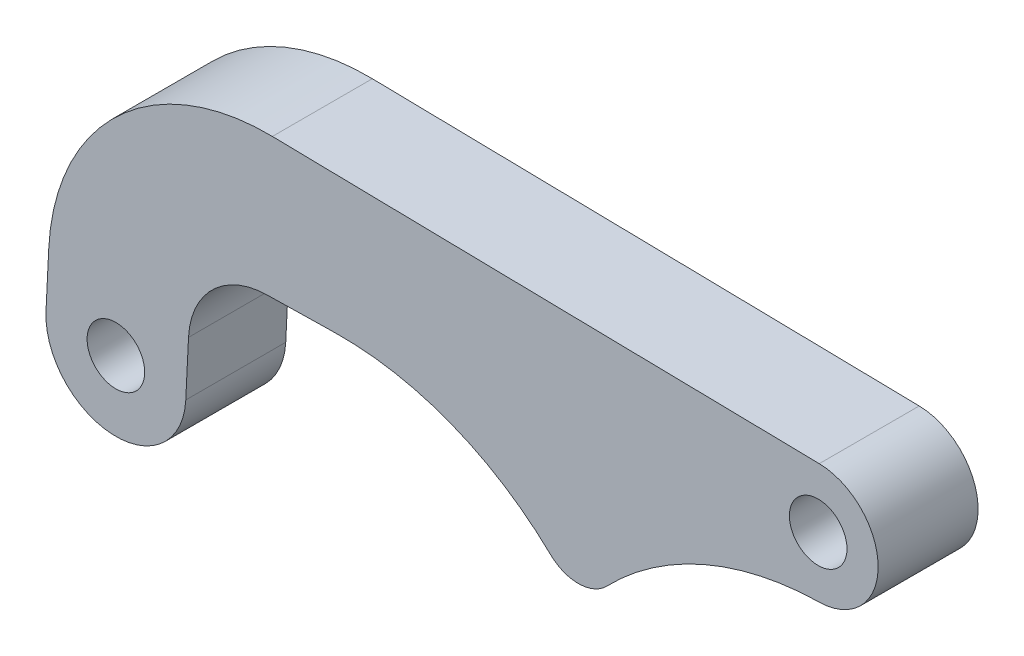
ISO-10303-21;
HEADER;
FILE_DESCRIPTION(('STEP AP214'),'2;1');
FILE_NAME('part.step','',(''),(''),'','','');
FILE_SCHEMA(('AUTOMOTIVE_DESIGN { 1 0 10303 214 1 1 1 1 }'));
ENDSEC;
DATA;
#1=APPLICATION_CONTEXT('core data for automotive mechanical design processes');
#2=APPLICATION_PROTOCOL_DEFINITION('international standard','automotive_design',2000,#1);
#3=PRODUCT_CONTEXT('',#1,'mechanical');
#4=PRODUCT('Part','Part','',(#3));
#5=PRODUCT_RELATED_PRODUCT_CATEGORY('part','',(#4));
#6=PRODUCT_DEFINITION_FORMATION('','',#4);
#7=PRODUCT_DEFINITION_CONTEXT('part definition',#1,'design');
#8=PRODUCT_DEFINITION('design','',#6,#7);
#9=PRODUCT_DEFINITION_SHAPE('','',#8);
#10=(LENGTH_UNIT() NAMED_UNIT(*) SI_UNIT(.MILLI.,.METRE.));
#11=(NAMED_UNIT(*) PLANE_ANGLE_UNIT() SI_UNIT($,.RADIAN.));
#12=(NAMED_UNIT(*) SI_UNIT($,.STERADIAN.) SOLID_ANGLE_UNIT());
#13=UNCERTAINTY_MEASURE_WITH_UNIT(LENGTH_MEASURE(1.E-05),#10,'distance_accuracy_value','');
#14=(GEOMETRIC_REPRESENTATION_CONTEXT(3) GLOBAL_UNCERTAINTY_ASSIGNED_CONTEXT((#13)) GLOBAL_UNIT_ASSIGNED_CONTEXT((#10,
#11,#12)) REPRESENTATION_CONTEXT('',''));
#15=CARTESIAN_POINT('',(0.,0.,0.));
#16=DIRECTION('',(0.,0.,1.));
#17=DIRECTION('',(1.,0.,0.));
#18=AXIS2_PLACEMENT_3D('',#15,#16,#17);
#19=CARTESIAN_POINT('',(56.2899549373158,-13.0988698531482,3.96875));
#20=DIRECTION('',(0.,0.,-1.));
#21=DIRECTION('',(-1.,0.,0.));
#22=AXIS2_PLACEMENT_3D('',#19,#20,#21);
#23=PLANE('',#22);
#24=CARTESIAN_POINT('',(56.2899549373158,-13.0988698531482,3.96875));
#25=DIRECTION('',(0.,0.,-1.));
#26=DIRECTION('',(-1.,0.,0.));
#27=AXIS2_PLACEMENT_3D('',#24,#25,#26);
#28=CIRCLE('',#27,24.0789684534632);
#29=CARTESIAN_POINT('',(38.995923428398,3.65562792957969,3.96875));
#30=VERTEX_POINT('',#29);
#31=CARTESIAN_POINT('',(55.8521603028593,10.9761183636904,3.96875));
#32=VERTEX_POINT('',#31);
#33=EDGE_CURVE('E206',#30,#32,#28,.T.);
#34=ORIENTED_EDGE('',*,*,#33,.T.);
#35=CARTESIAN_POINT('',(55.7655703415565,15.7378311257752,3.96875));
#36=DIRECTION('',(0.,0.,1.));
#37=DIRECTION('',(1.,0.,0.));
#38=AXIS2_PLACEMENT_3D('',#35,#36,#37);
#39=CIRCLE('',#38,4.7625);
#40=CARTESIAN_POINT('',(55.8521603028593,20.4995438878601,3.96875));
#41=VERTEX_POINT('',#40);
#42=EDGE_CURVE('E121',#32,#41,#39,.T.);
#43=ORIENTED_EDGE('',*,*,#42,.T.);
#44=DIRECTION('',(-0.999834700700227,0.018181619171209,0.));
#45=VECTOR('',#44,1.);
#46=CARTESIAN_POINT('',(55.8521603028593,20.4995438878601,3.96875));
#47=LINE('',#46,#45);
#48=CARTESIAN_POINT('',(12.4263390179737,21.2892261665865,3.96875));
#49=VERTEX_POINT('',#48);
#50=EDGE_CURVE('E235',#41,#49,#47,.T.);
#51=ORIENTED_EDGE('',*,*,#50,.T.);
#52=CARTESIAN_POINT('',(12.1088424931964,3.82961270560882,3.96875));
#53=DIRECTION('',(0.,0.,1.));
#54=DIRECTION('',(1.,0.,0.));
#55=AXIS2_PLACEMENT_3D('',#52,#53,#54);
#56=CIRCLE('',#55,17.4625);
#57=CARTESIAN_POINT('',(-5.33260441290076,4.68683850537986,3.96875));
#58=VERTEX_POINT('',#57);
#59=EDGE_CURVE('E255',#49,#58,#56,.T.);
#60=ORIENTED_EDGE('',*,*,#59,.T.);
#61=DIRECTION('',(-0.0490895232510259,-0.998794382596832,0.));
#62=VECTOR('',#61,1.);
#63=CARTESIAN_POINT('',(-5.54955128830365,0.272753663563513,3.96875));
#64=LINE('',#63,#62);
#65=CARTESIAN_POINT('',(-5.54955128830365,0.272753663563513,3.96875));
#66=VERTEX_POINT('',#65);
#67=EDGE_CURVE('E251',#58,#66,#64,.T.);
#68=ORIENTED_EDGE('',*,*,#67,.T.);
#69=CARTESIAN_POINT('',(0.,0.,3.96875));
#70=DIRECTION('',(0.,0.,1.));
#71=DIRECTION('',(1.,0.,0.));
#72=AXIS2_PLACEMENT_3D('',#69,#70,#71);
#73=CIRCLE('',#72,5.55625);
#74=CARTESIAN_POINT('',(5.54955128830365,-0.272753663563516,3.96875));
#75=VERTEX_POINT('',#74);
#76=EDGE_CURVE('E254',#66,#75,#73,.T.);
#77=ORIENTED_EDGE('',*,*,#76,.T.);
#78=DIRECTION('',(0.0490895232510259,0.998794382596832,0.));
#79=VECTOR('',#78,1.);
#80=CARTESIAN_POINT('',(5.54955128830365,-0.272753663563514,3.96875));
#81=LINE('',#80,#79);
#82=CARTESIAN_POINT('',(5.76649816370654,4.14133117825284,3.96875));
#83=VERTEX_POINT('',#82);
#84=EDGE_CURVE('E258',#75,#83,#81,.T.);
#85=ORIENTED_EDGE('',*,*,#84,.T.);
#86=CARTESIAN_POINT('',(12.1088424931964,3.82961270560882,3.96875));
#87=DIRECTION('',(0.,0.,-1.));
#88=DIRECTION('',(1.,0.,0.));
#89=AXIS2_PLACEMENT_3D('',#86,#87,#88);
#90=CIRCLE('',#89,6.35000000000001);
#91=CARTESIAN_POINT('',(11.9933892114592,10.1785630550553,3.96875));
#92=VERTEX_POINT('',#91);
#93=EDGE_CURVE('E155',#83,#92,#90,.T.);
#94=ORIENTED_EDGE('',*,*,#93,.T.);
#95=DIRECTION('',(0.999834700700227,0.0181816191712081,0.));
#96=VECTOR('',#95,1.);
#97=CARTESIAN_POINT('',(17.4058004576478,10.2769857243298,3.96875));
#98=LINE('',#97,#96);
#99=CARTESIAN_POINT('',(17.4058004576478,10.2769857243298,3.96875));
#100=VERTEX_POINT('',#99);
#101=EDGE_CURVE('E149',#92,#100,#98,.T.);
#102=ORIENTED_EDGE('',*,*,#101,.T.);
#103=CARTESIAN_POINT('',(17.8435950921042,-13.7980024925089,3.96875));
#104=DIRECTION('',(0.,0.,-1.));
#105=DIRECTION('',(-1.,0.,0.));
#106=AXIS2_PLACEMENT_3D('',#103,#104,#105);
#107=CIRCLE('',#106,24.0789684534632);
#108=CARTESIAN_POINT('',(34.5170456929599,3.57418121719502,3.96875));
#109=VERTEX_POINT('',#108);
#110=EDGE_CURVE('E153',#100,#109,#107,.T.);
#111=ORIENTED_EDGE('',*,*,#110,.T.);
#112=CARTESIAN_POINT('',(36.7155703415565,5.86483928192524,3.96875));
#113=DIRECTION('',(0.,0.,1.));
#114=DIRECTION('',(1.,0.,0.));
#115=AXIS2_PLACEMENT_3D('',#112,#113,#114);
#116=CIRCLE('',#115,3.175);
#117=EDGE_CURVE('E62',#109,#30,#116,.T.);
#118=ORIENTED_EDGE('',*,*,#117,.T.);
#119=EDGE_LOOP('',(#34,#43,#51,#60,#68,#77,#85,#94,#102,#111,#118));
#120=FACE_BOUND('',#119,.T.);
#121=CARTESIAN_POINT('',(0.,0.,3.96875));
#122=DIRECTION('',(0.,0.,1.));
#123=DIRECTION('',(1.,0.,0.));
#124=AXIS2_PLACEMENT_3D('',#121,#122,#123);
#125=CIRCLE('',#124,2.286);
#126=CARTESIAN_POINT('',(2.286,0.,3.96875));
#127=VERTEX_POINT('',#126);
#128=EDGE_CURVE('E181',#127,#127,#125,.T.);
#129=ORIENTED_EDGE('',*,*,#128,.F.);
#130=EDGE_LOOP('',(#129));
#131=FACE_BOUND('',#130,.T.);
#132=CARTESIAN_POINT('',(55.7655703415565,15.7378311257752,3.96875));
#133=DIRECTION('',(0.,0.,1.));
#134=DIRECTION('',(1.,0.,0.));
#135=AXIS2_PLACEMENT_3D('',#132,#133,#134);
#136=CIRCLE('',#135,2.286);
#137=CARTESIAN_POINT('',(58.0515703415565,15.7378311257752,3.96875));
#138=VERTEX_POINT('',#137);
#139=EDGE_CURVE('E272',#138,#138,#136,.T.);
#140=ORIENTED_EDGE('',*,*,#139,.F.);
#141=EDGE_LOOP('',(#140));
#142=FACE_BOUND('',#141,.T.);
#143=ADVANCED_FACE('F45',(#120,#131,#142),#23,.F.);
#144=CARTESIAN_POINT('',(56.2899549373158,-13.0988698531482,-3.96875));
#145=DIRECTION('',(0.,0.,-1.));
#146=DIRECTION('',(-1.,0.,0.));
#147=AXIS2_PLACEMENT_3D('',#144,#145,#146);
#148=PLANE('',#147);
#149=CARTESIAN_POINT('',(0.,0.,-3.96875));
#150=DIRECTION('',(0.,0.,1.));
#151=DIRECTION('',(1.,0.,0.));
#152=AXIS2_PLACEMENT_3D('',#149,#150,#151);
#153=CIRCLE('',#152,2.286);
#154=CARTESIAN_POINT('',(2.286,0.,-3.96875));
#155=VERTEX_POINT('',#154);
#156=EDGE_CURVE('E268',#155,#155,#153,.T.);
#157=ORIENTED_EDGE('',*,*,#156,.T.);
#158=EDGE_LOOP('',(#157));
#159=FACE_BOUND('',#158,.T.);
#160=CARTESIAN_POINT('',(56.2899549373158,-13.0988698531482,-3.96875));
#161=DIRECTION('',(0.,0.,-1.));
#162=DIRECTION('',(-1.,0.,0.));
#163=AXIS2_PLACEMENT_3D('',#160,#161,#162);
#164=CIRCLE('',#163,24.0789684534632);
#165=CARTESIAN_POINT('',(38.995923428398,3.65562792957969,-3.96875));
#166=VERTEX_POINT('',#165);
#167=CARTESIAN_POINT('',(55.8521603028593,10.9761183636904,-3.96875));
#168=VERTEX_POINT('',#167);
#169=EDGE_CURVE('E177',#166,#168,#164,.T.);
#170=ORIENTED_EDGE('',*,*,#169,.F.);
#171=CARTESIAN_POINT('',(36.7155703415565,5.86483928192524,-3.96875));
#172=DIRECTION('',(0.,0.,1.));
#173=DIRECTION('',(1.,0.,0.));
#174=AXIS2_PLACEMENT_3D('',#171,#172,#173);
#175=CIRCLE('',#174,3.175);
#176=CARTESIAN_POINT('',(34.5170456929599,3.57418121719502,-3.96875));
#177=VERTEX_POINT('',#176);
#178=EDGE_CURVE('E113',#177,#166,#175,.T.);
#179=ORIENTED_EDGE('',*,*,#178,.F.);
#180=CARTESIAN_POINT('',(17.8435950921042,-13.7980024925089,-3.96875));
#181=DIRECTION('',(0.,0.,-1.));
#182=DIRECTION('',(-1.,0.,0.));
#183=AXIS2_PLACEMENT_3D('',#180,#181,#182);
#184=CIRCLE('',#183,24.0789684534632);
#185=CARTESIAN_POINT('',(17.4058004576478,10.2769857243298,-3.96875));
#186=VERTEX_POINT('',#185);
#187=EDGE_CURVE('E107',#186,#177,#184,.T.);
#188=ORIENTED_EDGE('',*,*,#187,.F.);
#189=DIRECTION('',(0.999834700700227,0.0181816191712081,0.));
#190=VECTOR('',#189,1.);
#191=CARTESIAN_POINT('',(17.4058004576478,10.2769857243298,-3.96875));
#192=LINE('',#191,#190);
#193=CARTESIAN_POINT('',(11.9933892114592,10.1785630550553,-3.96875));
#194=VERTEX_POINT('',#193);
#195=EDGE_CURVE('E164',#194,#186,#192,.T.);
#196=ORIENTED_EDGE('',*,*,#195,.F.);
#197=CARTESIAN_POINT('',(12.1088424931964,3.82961270560882,-3.96875));
#198=DIRECTION('',(0.,0.,-1.));
#199=DIRECTION('',(1.,0.,0.));
#200=AXIS2_PLACEMENT_3D('',#197,#198,#199);
#201=CIRCLE('',#200,6.35000000000001);
#202=CARTESIAN_POINT('',(5.76649816370654,4.14133117825284,-3.96875));
#203=VERTEX_POINT('',#202);
#204=EDGE_CURVE('E198',#203,#194,#201,.T.);
#205=ORIENTED_EDGE('',*,*,#204,.F.);
#206=DIRECTION('',(0.0490895232510259,0.998794382596832,0.));
#207=VECTOR('',#206,1.);
#208=CARTESIAN_POINT('',(5.54955128830365,-0.272753663563514,-3.96875));
#209=LINE('',#208,#207);
#210=CARTESIAN_POINT('',(5.54955128830365,-0.272753663563516,-3.96875));
#211=VERTEX_POINT('',#210);
#212=EDGE_CURVE('E195',#211,#203,#209,.T.);
#213=ORIENTED_EDGE('',*,*,#212,.F.);
#214=CARTESIAN_POINT('',(0.,0.,-3.96875));
#215=DIRECTION('',(0.,0.,1.));
#216=DIRECTION('',(1.,0.,0.));
#217=AXIS2_PLACEMENT_3D('',#214,#215,#216);
#218=CIRCLE('',#217,5.55625);
#219=CARTESIAN_POINT('',(-5.54955128830365,0.272753663563513,-3.96875));
#220=VERTEX_POINT('',#219);
#221=EDGE_CURVE('E192',#220,#211,#218,.T.);
#222=ORIENTED_EDGE('',*,*,#221,.F.);
#223=DIRECTION('',(-0.0490895232510259,-0.998794382596832,0.));
#224=VECTOR('',#223,1.);
#225=CARTESIAN_POINT('',(-5.54955128830365,0.272753663563513,-3.96875));
#226=LINE('',#225,#224);
#227=CARTESIAN_POINT('',(-5.33260441290076,4.68683850537986,-3.96875));
#228=VERTEX_POINT('',#227);
#229=EDGE_CURVE('E189',#228,#220,#226,.T.);
#230=ORIENTED_EDGE('',*,*,#229,.F.);
#231=CARTESIAN_POINT('',(12.1088424931964,3.82961270560882,-3.96875));
#232=DIRECTION('',(0.,0.,1.));
#233=DIRECTION('',(1.,0.,0.));
#234=AXIS2_PLACEMENT_3D('',#231,#232,#233);
#235=CIRCLE('',#234,17.4625);
#236=CARTESIAN_POINT('',(12.4263390179737,21.2892261665865,-3.96875));
#237=VERTEX_POINT('',#236);
#238=EDGE_CURVE('E186',#237,#228,#235,.T.);
#239=ORIENTED_EDGE('',*,*,#238,.F.);
#240=DIRECTION('',(-0.999834700700227,0.018181619171209,0.));
#241=VECTOR('',#240,1.);
#242=CARTESIAN_POINT('',(55.8521603028593,20.4995438878601,-3.96875));
#243=LINE('',#242,#241);
#244=CARTESIAN_POINT('',(55.8521603028593,20.4995438878601,-3.96875));
#245=VERTEX_POINT('',#244);
#246=EDGE_CURVE('E183',#245,#237,#243,.T.);
#247=ORIENTED_EDGE('',*,*,#246,.F.);
#248=CARTESIAN_POINT('',(55.7655703415565,15.7378311257752,-3.96875));
#249=DIRECTION('',(0.,0.,1.));
#250=DIRECTION('',(1.,0.,0.));
#251=AXIS2_PLACEMENT_3D('',#248,#249,#250);
#252=CIRCLE('',#251,4.7625);
#253=EDGE_CURVE('E180',#168,#245,#252,.T.);
#254=ORIENTED_EDGE('',*,*,#253,.F.);
#255=EDGE_LOOP('',(#170,#179,#188,#196,#205,#213,#222,#230,#239,#247,#254));
#256=FACE_BOUND('',#255,.T.);
#257=CARTESIAN_POINT('',(55.7655703415565,15.7378311257752,-3.96875));
#258=DIRECTION('',(0.,0.,1.));
#259=DIRECTION('',(1.,0.,0.));
#260=AXIS2_PLACEMENT_3D('',#257,#258,#259);
#261=CIRCLE('',#260,2.286);
#262=CARTESIAN_POINT('',(58.0515703415565,15.7378311257752,-3.96875));
#263=VERTEX_POINT('',#262);
#264=EDGE_CURVE('E277',#263,#263,#261,.T.);
#265=ORIENTED_EDGE('',*,*,#264,.T.);
#266=EDGE_LOOP('',(#265));
#267=FACE_BOUND('',#266,.T.);
#268=ADVANCED_FACE('F239',(#159,#256,#267),#148,.T.);
#269=CARTESIAN_POINT('',(56.2899549373158,-13.0988698531482,3.96875));
#270=DIRECTION('',(0.,0.,-1.));
#271=DIRECTION('',(-1.,0.,0.));
#272=AXIS2_PLACEMENT_3D('',#269,#270,#271);
#273=CYLINDRICAL_SURFACE('',#272,24.0789684534632);
#274=ORIENTED_EDGE('',*,*,#169,.T.);
#275=DIRECTION('',(0.,0.,-1.));
#276=VECTOR('',#275,1.);
#277=CARTESIAN_POINT('',(55.8521603028593,10.9761183636904,3.96875));
#278=LINE('',#277,#276);
#279=EDGE_CURVE('E11',#32,#168,#278,.T.);
#280=ORIENTED_EDGE('',*,*,#279,.F.);
#281=ORIENTED_EDGE('',*,*,#33,.F.);
#282=DIRECTION('',(0.,0.,-1.));
#283=VECTOR('',#282,1.);
#284=CARTESIAN_POINT('',(38.995923428398,3.65562792957969,3.96875));
#285=LINE('',#284,#283);
#286=EDGE_CURVE('E173',#30,#166,#285,.T.);
#287=ORIENTED_EDGE('',*,*,#286,.T.);
#288=EDGE_LOOP('',(#274,#280,#281,#287));
#289=FACE_BOUND('',#288,.T.);
#290=ADVANCED_FACE('F47',(#289),#273,.F.);
#291=CARTESIAN_POINT('',(55.7655703415565,15.7378311257752,3.96875));
#292=DIRECTION('',(0.,0.,-1.));
#293=DIRECTION('',(-1.,0.,0.));
#294=AXIS2_PLACEMENT_3D('',#291,#292,#293);
#295=CYLINDRICAL_SURFACE('',#294,4.7625);
#296=ORIENTED_EDGE('',*,*,#253,.T.);
#297=DIRECTION('',(0.,0.,-1.));
#298=VECTOR('',#297,1.);
#299=CARTESIAN_POINT('',(55.8521603028593,20.4995438878601,3.96875));
#300=LINE('',#299,#298);
#301=EDGE_CURVE('E54',#41,#245,#300,.T.);
#302=ORIENTED_EDGE('',*,*,#301,.F.);
#303=ORIENTED_EDGE('',*,*,#42,.F.);
#304=ORIENTED_EDGE('',*,*,#279,.T.);
#305=EDGE_LOOP('',(#296,#302,#303,#304));
#306=FACE_BOUND('',#305,.T.);
#307=ADVANCED_FACE('F286',(#306),#295,.T.);
#308=CARTESIAN_POINT('',(55.8521603028593,20.4995438878601,3.96875));
#309=DIRECTION('',(-0.018181619171209,-0.999834700700227,0.));
#310=DIRECTION('',(0.999834700700227,-0.018181619171209,0.));
#311=AXIS2_PLACEMENT_3D('',#308,#309,#310);
#312=PLANE('',#311);
#313=ORIENTED_EDGE('',*,*,#246,.T.);
#314=DIRECTION('',(0.,0.,-1.));
#315=VECTOR('',#314,1.);
#316=CARTESIAN_POINT('',(12.4263390179737,21.2892261665865,3.96875));
#317=LINE('',#316,#315);
#318=EDGE_CURVE('E227',#49,#237,#317,.T.);
#319=ORIENTED_EDGE('',*,*,#318,.F.);
#320=ORIENTED_EDGE('',*,*,#50,.F.);
#321=ORIENTED_EDGE('',*,*,#301,.T.);
#322=EDGE_LOOP('',(#313,#319,#320,#321));
#323=FACE_BOUND('',#322,.T.);
#324=ADVANCED_FACE('F233',(#323),#312,.F.);
#325=CARTESIAN_POINT('',(12.1088424931964,3.82961270560882,3.96875));
#326=DIRECTION('',(0.,0.,-1.));
#327=DIRECTION('',(-1.,0.,0.));
#328=AXIS2_PLACEMENT_3D('',#325,#326,#327);
#329=CYLINDRICAL_SURFACE('',#328,17.4625);
#330=ORIENTED_EDGE('',*,*,#238,.T.);
#331=DIRECTION('',(0.,0.,-1.));
#332=VECTOR('',#331,1.);
#333=CARTESIAN_POINT('',(-5.33260441290076,4.68683850537986,3.96875));
#334=LINE('',#333,#332);
#335=EDGE_CURVE('E223',#58,#228,#334,.T.);
#336=ORIENTED_EDGE('',*,*,#335,.F.);
#337=ORIENTED_EDGE('',*,*,#59,.F.);
#338=ORIENTED_EDGE('',*,*,#318,.T.);
#339=EDGE_LOOP('',(#330,#336,#337,#338));
#340=FACE_BOUND('',#339,.T.);
#341=ADVANCED_FACE('F245',(#340),#329,.T.);
#342=CARTESIAN_POINT('',(-5.54955128830365,0.272753663563513,3.96875));
#343=DIRECTION('',(0.998794382596832,-0.0490895232510259,0.));
#344=DIRECTION('',(0.0490895232510259,0.998794382596832,0.));
#345=AXIS2_PLACEMENT_3D('',#342,#343,#344);
#346=PLANE('',#345);
#347=ORIENTED_EDGE('',*,*,#229,.T.);
#348=DIRECTION('',(0.,0.,-1.));
#349=VECTOR('',#348,1.);
#350=CARTESIAN_POINT('',(-5.54955128830365,0.272753663563513,3.96875));
#351=LINE('',#350,#349);
#352=EDGE_CURVE('E219',#66,#220,#351,.T.);
#353=ORIENTED_EDGE('',*,*,#352,.F.);
#354=ORIENTED_EDGE('',*,*,#67,.F.);
#355=ORIENTED_EDGE('',*,*,#335,.T.);
#356=EDGE_LOOP('',(#347,#353,#354,#355));
#357=FACE_BOUND('',#356,.T.);
#358=ADVANCED_FACE('F249',(#357),#346,.F.);
#359=CARTESIAN_POINT('',(0.,0.,3.96875));
#360=DIRECTION('',(0.,0.,-1.));
#361=DIRECTION('',(-1.,0.,0.));
#362=AXIS2_PLACEMENT_3D('',#359,#360,#361);
#363=CYLINDRICAL_SURFACE('',#362,5.55625);
#364=ORIENTED_EDGE('',*,*,#221,.T.);
#365=DIRECTION('',(0.,0.,-1.));
#366=VECTOR('',#365,1.);
#367=CARTESIAN_POINT('',(5.54955128830365,-0.272753663563516,3.96875));
#368=LINE('',#367,#366);
#369=EDGE_CURVE('E215',#75,#211,#368,.T.);
#370=ORIENTED_EDGE('',*,*,#369,.F.);
#371=ORIENTED_EDGE('',*,*,#76,.F.);
#372=ORIENTED_EDGE('',*,*,#352,.T.);
#373=EDGE_LOOP('',(#364,#370,#371,#372));
#374=FACE_BOUND('',#373,.T.);
#375=ADVANCED_FACE('F316',(#374),#363,.T.);
#376=CARTESIAN_POINT('',(5.54955128830365,-0.272753663563514,3.96875));
#377=DIRECTION('',(-0.998794382596832,0.0490895232510259,0.));
#378=DIRECTION('',(-0.0490895232510259,-0.998794382596832,0.));
#379=AXIS2_PLACEMENT_3D('',#376,#377,#378);
#380=PLANE('',#379);
#381=ORIENTED_EDGE('',*,*,#212,.T.);
#382=DIRECTION('',(0.,0.,-1.));
#383=VECTOR('',#382,1.);
#384=CARTESIAN_POINT('',(5.76649816370654,4.14133117825284,3.96875));
#385=LINE('',#384,#383);
#386=EDGE_CURVE('E211',#83,#203,#385,.T.);
#387=ORIENTED_EDGE('',*,*,#386,.F.);
#388=ORIENTED_EDGE('',*,*,#84,.F.);
#389=ORIENTED_EDGE('',*,*,#369,.T.);
#390=EDGE_LOOP('',(#381,#387,#388,#389));
#391=FACE_BOUND('',#390,.T.);
#392=ADVANCED_FACE('F312',(#391),#380,.F.);
#393=CARTESIAN_POINT('',(12.1088424931964,3.82961270560882,3.96875));
#394=DIRECTION('',(0.,0.,-1.));
#395=DIRECTION('',(-1.,0.,0.));
#396=AXIS2_PLACEMENT_3D('',#393,#394,#395);
#397=CYLINDRICAL_SURFACE('',#396,6.35000000000001);
#398=ORIENTED_EDGE('',*,*,#204,.T.);
#399=DIRECTION('',(0.,0.,-1.));
#400=VECTOR('',#399,1.);
#401=CARTESIAN_POINT('',(11.9933892114592,10.1785630550553,3.96875));
#402=LINE('',#401,#400);
#403=EDGE_CURVE('E166',#92,#194,#402,.T.);
#404=ORIENTED_EDGE('',*,*,#403,.F.);
#405=ORIENTED_EDGE('',*,*,#93,.F.);
#406=ORIENTED_EDGE('',*,*,#386,.T.);
#407=EDGE_LOOP('',(#398,#404,#405,#406));
#408=FACE_BOUND('',#407,.T.);
#409=ADVANCED_FACE('F309',(#408),#397,.F.);
#410=CARTESIAN_POINT('',(17.4058004576478,10.2769857243298,3.96875));
#411=DIRECTION('',(-0.0181816191712081,0.999834700700227,0.));
#412=DIRECTION('',(-0.999834700700228,-0.0181816191712081,0.));
#413=AXIS2_PLACEMENT_3D('',#410,#411,#412);
#414=PLANE('',#413);
#415=ORIENTED_EDGE('',*,*,#195,.T.);
#416=DIRECTION('',(0.,0.,-1.));
#417=VECTOR('',#416,1.);
#418=CARTESIAN_POINT('',(17.4058004576478,10.2769857243298,3.96875));
#419=LINE('',#418,#417);
#420=EDGE_CURVE('E161',#100,#186,#419,.T.);
#421=ORIENTED_EDGE('',*,*,#420,.F.);
#422=ORIENTED_EDGE('',*,*,#101,.F.);
#423=ORIENTED_EDGE('',*,*,#403,.T.);
#424=EDGE_LOOP('',(#415,#421,#422,#423));
#425=FACE_BOUND('',#424,.T.);
#426=ADVANCED_FACE('F162',(#425),#414,.F.);
#427=CARTESIAN_POINT('',(17.8435950921042,-13.7980024925089,3.96875));
#428=DIRECTION('',(0.,0.,-1.));
#429=DIRECTION('',(-1.,0.,0.));
#430=AXIS2_PLACEMENT_3D('',#427,#428,#429);
#431=CYLINDRICAL_SURFACE('',#430,24.0789684534632);
#432=ORIENTED_EDGE('',*,*,#187,.T.);
#433=DIRECTION('',(0.,0.,-1.));
#434=VECTOR('',#433,1.);
#435=CARTESIAN_POINT('',(34.5170456929599,3.57418121719502,3.96875));
#436=LINE('',#435,#434);
#437=EDGE_CURVE('E167',#109,#177,#436,.T.);
#438=ORIENTED_EDGE('',*,*,#437,.F.);
#439=ORIENTED_EDGE('',*,*,#110,.F.);
#440=ORIENTED_EDGE('',*,*,#420,.T.);
#441=EDGE_LOOP('',(#432,#438,#439,#440));
#442=FACE_BOUND('',#441,.T.);
#443=ADVANCED_FACE('F169',(#442),#431,.F.);
#444=CARTESIAN_POINT('',(36.7155703415565,5.86483928192524,3.96875));
#445=DIRECTION('',(0.,0.,-1.));
#446=DIRECTION('',(-1.,0.,0.));
#447=AXIS2_PLACEMENT_3D('',#444,#445,#446);
#448=CYLINDRICAL_SURFACE('',#447,3.175);
#449=ORIENTED_EDGE('',*,*,#178,.T.);
#450=ORIENTED_EDGE('',*,*,#286,.F.);
#451=ORIENTED_EDGE('',*,*,#117,.F.);
#452=ORIENTED_EDGE('',*,*,#437,.T.);
#453=EDGE_LOOP('',(#449,#450,#451,#452));
#454=FACE_BOUND('',#453,.T.);
#455=ADVANCED_FACE('F302',(#454),#448,.T.);
#456=CARTESIAN_POINT('',(0.,0.,3.96875));
#457=DIRECTION('',(0.,0.,-1.));
#458=DIRECTION('',(-1.,0.,0.));
#459=AXIS2_PLACEMENT_3D('',#456,#457,#458);
#460=CYLINDRICAL_SURFACE('',#459,2.286);
#461=ORIENTED_EDGE('',*,*,#128,.T.);
#462=EDGE_LOOP('',(#461));
#463=FACE_BOUND('',#462,.T.);
#464=ORIENTED_EDGE('',*,*,#156,.F.);
#465=EDGE_LOOP('',(#464));
#466=FACE_BOUND('',#465,.T.);
#467=ADVANCED_FACE('F299',(#463,#466),#460,.F.);
#468=CARTESIAN_POINT('',(55.7655703415565,15.7378311257752,3.96875));
#469=DIRECTION('',(0.,0.,-1.));
#470=DIRECTION('',(-1.,0.,0.));
#471=AXIS2_PLACEMENT_3D('',#468,#469,#470);
#472=CYLINDRICAL_SURFACE('',#471,2.286);
#473=ORIENTED_EDGE('',*,*,#139,.T.);
#474=EDGE_LOOP('',(#473));
#475=FACE_BOUND('',#474,.T.);
#476=ORIENTED_EDGE('',*,*,#264,.F.);
#477=EDGE_LOOP('',(#476));
#478=FACE_BOUND('',#477,.T.);
#479=ADVANCED_FACE('F370',(#475,#478),#472,.F.);
#480=CLOSED_SHELL('',(#143,#268,#290,#307,#324,#341,#358,#375,#392,#409,#426,#443,#455,#467,#479));
#481=MANIFOLD_SOLID_BREP('B2',#480);
#482=ADVANCED_BREP_SHAPE_REPRESENTATION('',(#18,#481),#14);
#483=SHAPE_DEFINITION_REPRESENTATION(#9,#482);
ENDSEC;
END-ISO-10303-21;
